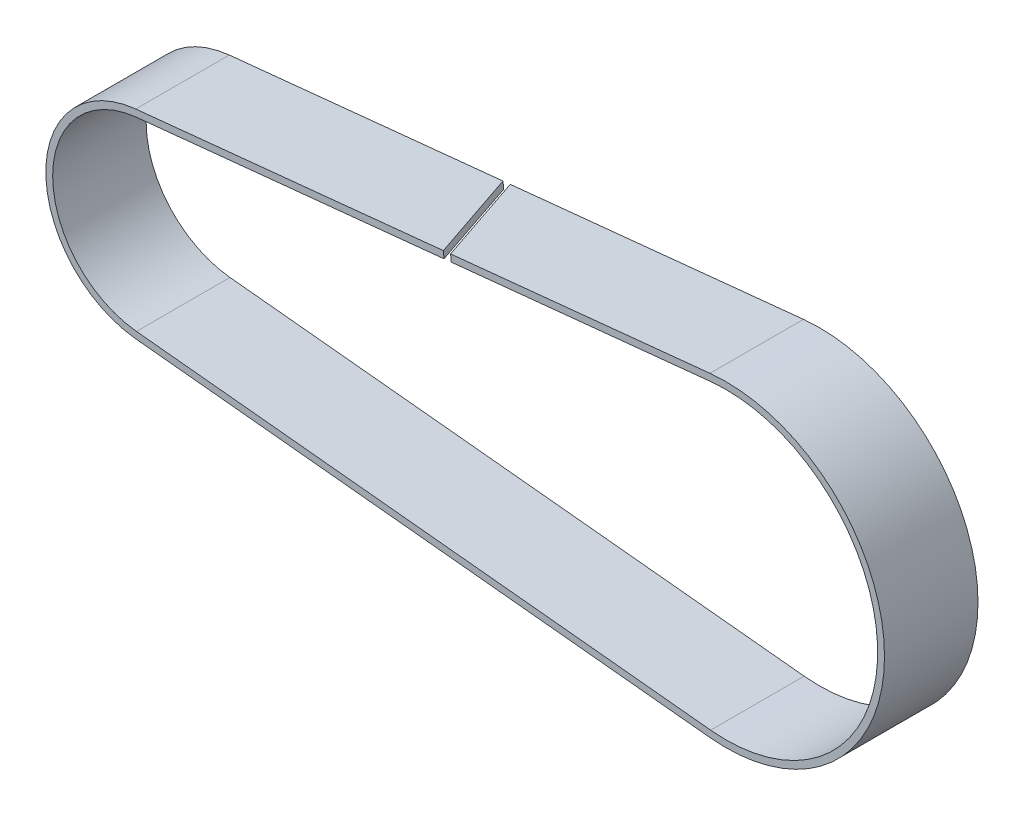
ISO-10303-21;
HEADER;
FILE_DESCRIPTION(('STEP AP214'),'2;1');
FILE_NAME('part.step','',(''),(''),'','','');
FILE_SCHEMA(('AUTOMOTIVE_DESIGN { 1 0 10303 214 1 1 1 1 }'));
ENDSEC;
DATA;
#1=APPLICATION_CONTEXT('core data for automotive mechanical design processes');
#2=APPLICATION_PROTOCOL_DEFINITION('international standard','automotive_design',2000,#1);
#3=PRODUCT_CONTEXT('',#1,'mechanical');
#4=PRODUCT('Part','Part','',(#3));
#5=PRODUCT_RELATED_PRODUCT_CATEGORY('part','',(#4));
#6=PRODUCT_DEFINITION_FORMATION('','',#4);
#7=PRODUCT_DEFINITION_CONTEXT('part definition',#1,'design');
#8=PRODUCT_DEFINITION('design','',#6,#7);
#9=PRODUCT_DEFINITION_SHAPE('','',#8);
#10=(LENGTH_UNIT() NAMED_UNIT(*) SI_UNIT(.MILLI.,.METRE.));
#11=(NAMED_UNIT(*) PLANE_ANGLE_UNIT() SI_UNIT($,.RADIAN.));
#12=(NAMED_UNIT(*) SI_UNIT($,.STERADIAN.) SOLID_ANGLE_UNIT());
#13=UNCERTAINTY_MEASURE_WITH_UNIT(LENGTH_MEASURE(1.E-05),#10,'distance_accuracy_value','');
#14=(GEOMETRIC_REPRESENTATION_CONTEXT(3) GLOBAL_UNCERTAINTY_ASSIGNED_CONTEXT((#13)) GLOBAL_UNIT_ASSIGNED_CONTEXT((#10,
#11,#12)) REPRESENTATION_CONTEXT('',''));
#15=CARTESIAN_POINT('',(0.,0.,0.));
#16=DIRECTION('',(0.,0.,1.));
#17=DIRECTION('',(1.,0.,0.));
#18=AXIS2_PLACEMENT_3D('',#15,#16,#17);
#19=CARTESIAN_POINT('',(-259.435265009831,43.752162452675,20.55));
#20=DIRECTION('',(0.100855584803891,-0.994901075993923,0.));
#21=DIRECTION('',(0.994901075993923,0.100855584803891,0.));
#22=AXIS2_PLACEMENT_3D('',#19,#20,#21);
#23=PLANE('',#22);
#24=DIRECTION('',(-0.994901075993923,-0.100855584803891,0.));
#25=VECTOR('',#24,1.);
#26=CARTESIAN_POINT('',(-259.435265009831,43.752162452675,-20.55));
#27=LINE('',#26,#25);
#28=CARTESIAN_POINT('',(-7.02908650129573,69.3392015622289,-20.55));
#29=VERTEX_POINT('',#28);
#30=CARTESIAN_POINT('',(-135.939003826332,56.2712841455658,-20.55));
#31=VERTEX_POINT('',#30);
#32=EDGE_CURVE('E141',#29,#31,#27,.T.);
#33=ORIENTED_EDGE('',*,*,#32,.T.);
#34=DIRECTION('',(-0.340276208606307,-0.0344946415698214,-0.939692620785907));
#35=VECTOR('',#34,1.);
#36=CARTESIAN_POINT('',(-136.310555060417,56.2336190772466,-21.576060429977));
#37=LINE('',#36,#35);
#38=CARTESIAN_POINT('',(-121.056102902812,57.7800006526019,20.55));
#39=VERTEX_POINT('',#38);
#40=EDGE_CURVE('E126',#39,#31,#37,.T.);
#41=ORIENTED_EDGE('',*,*,#40,.F.);
#42=DIRECTION('',(-0.994901075993923,-0.100855584803891,0.));
#43=VECTOR('',#42,1.);
#44=CARTESIAN_POINT('',(-7.02908650129573,69.3392015622289,20.55));
#45=LINE('',#44,#43);
#46=CARTESIAN_POINT('',(-7.02908650129573,69.3392015622289,20.55));
#47=VERTEX_POINT('',#46);
#48=EDGE_CURVE('E199',#47,#39,#45,.T.);
#49=ORIENTED_EDGE('',*,*,#48,.F.);
#50=DIRECTION('',(0.,0.,1.));
#51=VECTOR('',#50,1.);
#52=CARTESIAN_POINT('',(-7.02908650129573,69.3392015622289,-20.55));
#53=LINE('',#52,#51);
#54=EDGE_CURVE('E194',#29,#47,#53,.T.);
#55=ORIENTED_EDGE('',*,*,#54,.F.);
#56=EDGE_LOOP('',(#33,#41,#49,#55));
#57=FACE_BOUND('',#56,.T.);
#58=ADVANCED_FACE('F32',(#57),#23,.F.);
#59=CARTESIAN_POINT('',(-259.13269825542,40.7674592246933,20.55));
#60=DIRECTION('',(0.100855584803891,-0.994901075993923,0.));
#61=DIRECTION('',(0.994901075993923,0.100855584803891,0.));
#62=AXIS2_PLACEMENT_3D('',#59,#60,#61);
#63=PLANE('',#62);
#64=DIRECTION('',(0.340276208606307,0.0344946415698213,0.939692620785907));
#65=VECTOR('',#64,1.);
#66=CARTESIAN_POINT('',(-136.94082311414,53.1543520756697,-24.152138226324));
#67=LINE('',#66,#65);
#68=CARTESIAN_POINT('',(-135.63643707192,53.286580917584,-20.55));
#69=VERTEX_POINT('',#68);
#70=CARTESIAN_POINT('',(-120.753536148401,54.7952974246201,20.55));
#71=VERTEX_POINT('',#70);
#72=EDGE_CURVE('E11',#69,#71,#67,.T.);
#73=ORIENTED_EDGE('',*,*,#72,.F.);
#74=DIRECTION('',(-0.994901075993923,-0.100855584803891,0.));
#75=VECTOR('',#74,1.);
#76=CARTESIAN_POINT('',(-259.13269825542,40.7674592246933,-20.55));
#77=LINE('',#76,#75);
#78=CARTESIAN_POINT('',(-6.72651974688405,66.3544983342471,-20.55));
#79=VERTEX_POINT('',#78);
#80=EDGE_CURVE('E183',#79,#69,#77,.T.);
#81=ORIENTED_EDGE('',*,*,#80,.F.);
#82=DIRECTION('',(0.,0.,-1.));
#83=VECTOR('',#82,1.);
#84=CARTESIAN_POINT('',(-6.72651974688405,66.3544983342471,20.55));
#85=LINE('',#84,#83);
#86=CARTESIAN_POINT('',(-6.72651974688404,66.3544983342471,20.55));
#87=VERTEX_POINT('',#86);
#88=EDGE_CURVE('E173',#87,#79,#85,.T.);
#89=ORIENTED_EDGE('',*,*,#88,.F.);
#90=DIRECTION('',(-0.994901075993923,-0.100855584803891,0.));
#91=VECTOR('',#90,1.);
#92=CARTESIAN_POINT('',(-259.13269825542,40.7674592246933,20.55));
#93=LINE('',#92,#91);
#94=EDGE_CURVE('E182',#87,#71,#93,.T.);
#95=ORIENTED_EDGE('',*,*,#94,.T.);
#96=EDGE_LOOP('',(#73,#81,#89,#95));
#97=FACE_BOUND('',#96,.T.);
#98=ADVANCED_FACE('F236',(#97),#63,.T.);
#99=CARTESIAN_POINT('',(-255.,0.,20.55));
#100=DIRECTION('',(0.,0.,1.));
#101=DIRECTION('',(1.,0.,0.));
#102=AXIS2_PLACEMENT_3D('',#99,#100,#101);
#103=PLANE('',#102);
#104=DIRECTION('',(-0.100855584803891,0.994901075993923,0.));
#105=VECTOR('',#104,1.);
#106=CARTESIAN_POINT('',(-120.047547054774,47.8309898926627,20.55));
#107=LINE('',#106,#105);
#108=EDGE_CURVE('E125',#71,#39,#107,.T.);
#109=ORIENTED_EDGE('',*,*,#108,.F.);
#110=ORIENTED_EDGE('',*,*,#94,.F.);
#111=CARTESIAN_POINT('',(0.,0.,20.55));
#112=DIRECTION('',(0.,0.,1.));
#113=DIRECTION('',(1.,0.,0.));
#114=AXIS2_PLACEMENT_3D('',#111,#112,#113);
#115=CIRCLE('',#114,66.6945688725463);
#116=CARTESIAN_POINT('',(-6.72651974688407,-66.3544983342471,20.55));
#117=VERTEX_POINT('',#116);
#118=EDGE_CURVE('E177',#117,#87,#115,.T.);
#119=ORIENTED_EDGE('',*,*,#118,.F.);
#120=DIRECTION('',(0.994901075993923,-0.100855584803891,0.));
#121=VECTOR('',#120,1.);
#122=CARTESIAN_POINT('',(-259.13269825542,-40.7674592246933,20.55));
#123=LINE('',#122,#121);
#124=CARTESIAN_POINT('',(-259.13269825542,-40.7674592246933,20.55));
#125=VERTEX_POINT('',#124);
#126=EDGE_CURVE('E174',#125,#117,#123,.T.);
#127=ORIENTED_EDGE('',*,*,#126,.F.);
#128=CARTESIAN_POINT('',(-255.,0.,20.55));
#129=DIRECTION('',(0.,0.,1.));
#130=DIRECTION('',(1.,0.,0.));
#131=AXIS2_PLACEMENT_3D('',#128,#129,#130);
#132=CIRCLE('',#131,40.9763947475541);
#133=CARTESIAN_POINT('',(-259.13269825542,40.7674592246933,20.55));
#134=VERTEX_POINT('',#133);
#135=EDGE_CURVE('E169',#134,#125,#132,.T.);
#136=ORIENTED_EDGE('',*,*,#135,.F.);
#137=CARTESIAN_POINT('',(-123.929790981056,54.473312609885,20.55));
#138=VERTEX_POINT('',#137);
#139=EDGE_CURVE('E190',#138,#134,#93,.T.);
#140=ORIENTED_EDGE('',*,*,#139,.F.);
#141=DIRECTION('',(0.100855584803891,-0.994901075993923,0.));
#142=VECTOR('',#141,1.);
#143=CARTESIAN_POINT('',(-119.797092725636,13.7058533851917,20.55));
#144=LINE('',#143,#142);
#145=CARTESIAN_POINT('',(-124.232357735468,57.4580158378668,20.55));
#146=VERTEX_POINT('',#145);
#147=EDGE_CURVE('E54',#146,#138,#144,.T.);
#148=ORIENTED_EDGE('',*,*,#147,.F.);
#149=CARTESIAN_POINT('',(-259.435265009831,43.752162452675,20.55));
#150=VERTEX_POINT('',#149);
#151=EDGE_CURVE('E134',#146,#150,#45,.T.);
#152=ORIENTED_EDGE('',*,*,#151,.T.);
#153=CARTESIAN_POINT('',(-255.,0.,20.55));
#154=DIRECTION('',(0.,0.,1.));
#155=DIRECTION('',(1.,0.,0.));
#156=AXIS2_PLACEMENT_3D('',#153,#154,#155);
#157=CIRCLE('',#156,43.9763947475541);
#158=CARTESIAN_POINT('',(-259.435265009831,-43.752162452675,20.55));
#159=VERTEX_POINT('',#158);
#160=EDGE_CURVE('E165',#150,#159,#157,.T.);
#161=ORIENTED_EDGE('',*,*,#160,.T.);
#162=DIRECTION('',(0.994901075993923,-0.100855584803891,0.));
#163=VECTOR('',#162,1.);
#164=CARTESIAN_POINT('',(-259.435265009831,-43.752162452675,20.55));
#165=LINE('',#164,#163);
#166=CARTESIAN_POINT('',(-7.02908650129563,-69.3392015622289,20.55));
#167=VERTEX_POINT('',#166);
#168=EDGE_CURVE('E161',#159,#167,#165,.T.);
#169=ORIENTED_EDGE('',*,*,#168,.T.);
#170=CARTESIAN_POINT('',(0.,0.,20.55));
#171=DIRECTION('',(0.,0.,1.));
#172=DIRECTION('',(1.,0.,0.));
#173=AXIS2_PLACEMENT_3D('',#170,#171,#172);
#174=CIRCLE('',#173,69.6945688725463);
#175=EDGE_CURVE('E159',#167,#47,#174,.T.);
#176=ORIENTED_EDGE('',*,*,#175,.T.);
#177=ORIENTED_EDGE('',*,*,#48,.T.);
#178=EDGE_LOOP('',(#109,#110,#119,#127,#136,#140,#148,#152,#161,#169,#176,#177));
#179=FACE_BOUND('',#178,.T.);
#180=ADVANCED_FACE('F34',(#179),#103,.T.);
#181=CARTESIAN_POINT('',(-255.,0.,-20.55));
#182=DIRECTION('',(0.,0.,1.));
#183=DIRECTION('',(1.,0.,0.));
#184=AXIS2_PLACEMENT_3D('',#181,#182,#183);
#185=PLANE('',#184);
#186=ORIENTED_EDGE('',*,*,#80,.T.);
#187=DIRECTION('',(-0.100855584803891,0.994901075993923,0.));
#188=VECTOR('',#187,1.);
#189=CARTESIAN_POINT('',(-131.503738816501,12.5191216928908,-20.55));
#190=LINE('',#189,#188);
#191=EDGE_CURVE('E46',#69,#31,#190,.T.);
#192=ORIENTED_EDGE('',*,*,#191,.T.);
#193=ORIENTED_EDGE('',*,*,#32,.F.);
#194=CARTESIAN_POINT('',(0.,0.,-20.55));
#195=DIRECTION('',(0.,0.,1.));
#196=DIRECTION('',(1.,0.,0.));
#197=AXIS2_PLACEMENT_3D('',#194,#195,#196);
#198=CIRCLE('',#197,69.6945688725463);
#199=CARTESIAN_POINT('',(-7.02908650129563,-69.3392015622289,-20.55));
#200=VERTEX_POINT('',#199);
#201=EDGE_CURVE('E151',#200,#29,#198,.T.);
#202=ORIENTED_EDGE('',*,*,#201,.F.);
#203=DIRECTION('',(0.994901075993923,-0.100855584803891,0.));
#204=VECTOR('',#203,1.);
#205=CARTESIAN_POINT('',(-259.435265009831,-43.752162452675,-20.55));
#206=LINE('',#205,#204);
#207=CARTESIAN_POINT('',(-259.435265009831,-43.752162452675,-20.55));
#208=VERTEX_POINT('',#207);
#209=EDGE_CURVE('E155',#208,#200,#206,.T.);
#210=ORIENTED_EDGE('',*,*,#209,.F.);
#211=CARTESIAN_POINT('',(-255.,0.,-20.55));
#212=DIRECTION('',(0.,0.,1.));
#213=DIRECTION('',(1.,0.,0.));
#214=AXIS2_PLACEMENT_3D('',#211,#212,#213);
#215=CIRCLE('',#214,43.9763947475541);
#216=CARTESIAN_POINT('',(-259.435265009831,43.752162452675,-20.55));
#217=VERTEX_POINT('',#216);
#218=EDGE_CURVE('E139',#217,#208,#215,.T.);
#219=ORIENTED_EDGE('',*,*,#218,.F.);
#220=CARTESIAN_POINT('',(-139.115258658987,55.9492993308308,-20.55));
#221=VERTEX_POINT('',#220);
#222=EDGE_CURVE('E132',#221,#217,#27,.T.);
#223=ORIENTED_EDGE('',*,*,#222,.F.);
#224=DIRECTION('',(-0.100855584803891,0.994901075993923,0.));
#225=VECTOR('',#224,1.);
#226=CARTESIAN_POINT('',(-138.106702810948,46.0002885708915,-20.55));
#227=LINE('',#226,#225);
#228=CARTESIAN_POINT('',(-138.812691904576,52.9645961028489,-20.55));
#229=VERTEX_POINT('',#228);
#230=EDGE_CURVE('E118',#229,#221,#227,.T.);
#231=ORIENTED_EDGE('',*,*,#230,.F.);
#232=CARTESIAN_POINT('',(-259.13269825542,40.7674592246933,-20.55));
#233=VERTEX_POINT('',#232);
#234=EDGE_CURVE('E164',#229,#233,#77,.T.);
#235=ORIENTED_EDGE('',*,*,#234,.T.);
#236=CARTESIAN_POINT('',(-255.,0.,-20.55));
#237=DIRECTION('',(0.,0.,1.));
#238=DIRECTION('',(1.,0.,0.));
#239=AXIS2_PLACEMENT_3D('',#236,#237,#238);
#240=CIRCLE('',#239,40.9763947475541);
#241=CARTESIAN_POINT('',(-259.13269825542,-40.7674592246933,-20.55));
#242=VERTEX_POINT('',#241);
#243=EDGE_CURVE('E184',#233,#242,#240,.T.);
#244=ORIENTED_EDGE('',*,*,#243,.T.);
#245=DIRECTION('',(0.994901075993923,-0.100855584803891,0.));
#246=VECTOR('',#245,1.);
#247=CARTESIAN_POINT('',(-259.13269825542,-40.7674592246933,-20.55));
#248=LINE('',#247,#246);
#249=CARTESIAN_POINT('',(-6.72651974688407,-66.3544983342471,-20.55));
#250=VERTEX_POINT('',#249);
#251=EDGE_CURVE('E145',#242,#250,#248,.T.);
#252=ORIENTED_EDGE('',*,*,#251,.T.);
#253=CARTESIAN_POINT('',(0.,0.,-20.55));
#254=DIRECTION('',(0.,0.,1.));
#255=DIRECTION('',(1.,0.,0.));
#256=AXIS2_PLACEMENT_3D('',#253,#254,#255);
#257=CIRCLE('',#256,66.6945688725463);
#258=EDGE_CURVE('E142',#250,#79,#257,.T.);
#259=ORIENTED_EDGE('',*,*,#258,.T.);
#260=EDGE_LOOP('',(#186,#192,#193,#202,#210,#219,#223,#231,#235,#244,#252,#259));
#261=FACE_BOUND('',#260,.T.);
#262=ADVANCED_FACE('F137',(#261),#185,.F.);
#263=ORIENTED_EDGE('',*,*,#151,.F.);
#264=DIRECTION('',(0.340276208606307,0.0344946415698212,0.939692620785907));
#265=VECTOR('',#264,1.);
#266=CARTESIAN_POINT('',(-139.115258658987,55.9492993308308,-20.55));
#267=LINE('',#266,#265);
#268=EDGE_CURVE('E121',#221,#146,#267,.T.);
#269=ORIENTED_EDGE('',*,*,#268,.F.);
#270=ORIENTED_EDGE('',*,*,#222,.T.);
#271=DIRECTION('',(0.,0.,1.));
#272=VECTOR('',#271,1.);
#273=CARTESIAN_POINT('',(-259.435265009831,43.752162452675,-20.55));
#274=LINE('',#273,#272);
#275=EDGE_CURVE('E181',#217,#150,#274,.T.);
#276=ORIENTED_EDGE('',*,*,#275,.T.);
#277=EDGE_LOOP('',(#263,#269,#270,#276));
#278=FACE_BOUND('',#277,.T.);
#279=ADVANCED_FACE('F130',(#278),#23,.F.);
#280=CARTESIAN_POINT('',(-255.,0.,20.55));
#281=DIRECTION('',(0.,0.,-1.));
#282=DIRECTION('',(-1.,0.,0.));
#283=AXIS2_PLACEMENT_3D('',#280,#281,#282);
#284=CYLINDRICAL_SURFACE('',#283,43.9763947475541);
#285=DIRECTION('',(0.,0.,-1.));
#286=VECTOR('',#285,1.);
#287=CARTESIAN_POINT('',(-259.435265009831,-43.752162452675,20.55));
#288=LINE('',#287,#286);
#289=EDGE_CURVE('E154',#159,#208,#288,.T.);
#290=ORIENTED_EDGE('',*,*,#289,.F.);
#291=ORIENTED_EDGE('',*,*,#160,.F.);
#292=ORIENTED_EDGE('',*,*,#275,.F.);
#293=ORIENTED_EDGE('',*,*,#218,.T.);
#294=EDGE_LOOP('',(#290,#291,#292,#293));
#295=FACE_BOUND('',#294,.T.);
#296=ADVANCED_FACE('F209',(#295),#284,.T.);
#297=CARTESIAN_POINT('',(-259.435265009831,-43.752162452675,20.55));
#298=DIRECTION('',(0.100855584803891,0.994901075993923,0.));
#299=DIRECTION('',(-0.994901075993923,0.100855584803891,0.));
#300=AXIS2_PLACEMENT_3D('',#297,#298,#299);
#301=PLANE('',#300);
#302=DIRECTION('',(0.,0.,-1.));
#303=VECTOR('',#302,1.);
#304=CARTESIAN_POINT('',(-7.02908650129563,-69.3392015622289,20.55));
#305=LINE('',#304,#303);
#306=EDGE_CURVE('E149',#167,#200,#305,.T.);
#307=ORIENTED_EDGE('',*,*,#306,.F.);
#308=ORIENTED_EDGE('',*,*,#168,.F.);
#309=ORIENTED_EDGE('',*,*,#289,.T.);
#310=ORIENTED_EDGE('',*,*,#209,.T.);
#311=EDGE_LOOP('',(#307,#308,#309,#310));
#312=FACE_BOUND('',#311,.T.);
#313=ADVANCED_FACE('F225',(#312),#301,.F.);
#314=CARTESIAN_POINT('',(0.,0.,20.55));
#315=DIRECTION('',(0.,0.,-1.));
#316=DIRECTION('',(-1.,0.,0.));
#317=AXIS2_PLACEMENT_3D('',#314,#315,#316);
#318=CYLINDRICAL_SURFACE('',#317,69.6945688725463);
#319=ORIENTED_EDGE('',*,*,#175,.F.);
#320=ORIENTED_EDGE('',*,*,#306,.T.);
#321=ORIENTED_EDGE('',*,*,#201,.T.);
#322=ORIENTED_EDGE('',*,*,#54,.T.);
#323=EDGE_LOOP('',(#319,#320,#321,#322));
#324=FACE_BOUND('',#323,.T.);
#325=ADVANCED_FACE('F222',(#324),#318,.T.);
#326=CARTESIAN_POINT('',(-255.,0.,20.55));
#327=DIRECTION('',(0.,0.,-1.));
#328=DIRECTION('',(-1.,0.,0.));
#329=AXIS2_PLACEMENT_3D('',#326,#327,#328);
#330=CYLINDRICAL_SURFACE('',#329,40.9763947475541);
#331=DIRECTION('',(0.,0.,-1.));
#332=VECTOR('',#331,1.);
#333=CARTESIAN_POINT('',(-259.13269825542,-40.7674592246933,20.55));
#334=LINE('',#333,#332);
#335=EDGE_CURVE('E166',#125,#242,#334,.T.);
#336=ORIENTED_EDGE('',*,*,#335,.T.);
#337=ORIENTED_EDGE('',*,*,#243,.F.);
#338=DIRECTION('',(0.,0.,-1.));
#339=VECTOR('',#338,1.);
#340=CARTESIAN_POINT('',(-259.13269825542,40.7674592246933,20.55));
#341=LINE('',#340,#339);
#342=EDGE_CURVE('E178',#134,#233,#341,.T.);
#343=ORIENTED_EDGE('',*,*,#342,.F.);
#344=ORIENTED_EDGE('',*,*,#135,.T.);
#345=EDGE_LOOP('',(#336,#337,#343,#344));
#346=FACE_BOUND('',#345,.T.);
#347=ADVANCED_FACE('F232',(#346),#330,.F.);
#348=CARTESIAN_POINT('',(-259.13269825542,-40.7674592246933,20.55));
#349=DIRECTION('',(0.100855584803891,0.994901075993923,0.));
#350=DIRECTION('',(-0.994901075993923,0.100855584803891,0.));
#351=AXIS2_PLACEMENT_3D('',#348,#349,#350);
#352=PLANE('',#351);
#353=ORIENTED_EDGE('',*,*,#126,.T.);
#354=DIRECTION('',(0.,0.,-1.));
#355=VECTOR('',#354,1.);
#356=CARTESIAN_POINT('',(-6.72651974688407,-66.3544983342471,20.55));
#357=LINE('',#356,#355);
#358=EDGE_CURVE('E170',#117,#250,#357,.T.);
#359=ORIENTED_EDGE('',*,*,#358,.T.);
#360=ORIENTED_EDGE('',*,*,#251,.F.);
#361=ORIENTED_EDGE('',*,*,#335,.F.);
#362=EDGE_LOOP('',(#353,#359,#360,#361));
#363=FACE_BOUND('',#362,.T.);
#364=ADVANCED_FACE('F258',(#363),#352,.T.);
#365=CARTESIAN_POINT('',(0.,0.,20.55));
#366=DIRECTION('',(0.,0.,-1.));
#367=DIRECTION('',(-1.,0.,0.));
#368=AXIS2_PLACEMENT_3D('',#365,#366,#367);
#369=CYLINDRICAL_SURFACE('',#368,66.6945688725463);
#370=ORIENTED_EDGE('',*,*,#88,.T.);
#371=ORIENTED_EDGE('',*,*,#258,.F.);
#372=ORIENTED_EDGE('',*,*,#358,.F.);
#373=ORIENTED_EDGE('',*,*,#118,.T.);
#374=EDGE_LOOP('',(#370,#371,#372,#373));
#375=FACE_BOUND('',#374,.T.);
#376=ADVANCED_FACE('F254',(#375),#369,.F.);
#377=DIRECTION('',(-0.340276208606307,-0.0344946415698213,-0.939692620785907));
#378=VECTOR('',#377,1.);
#379=CARTESIAN_POINT('',(-139.74552671271,52.8700323292539,-23.126077796347));
#380=LINE('',#379,#378);
#381=EDGE_CURVE('E40',#138,#229,#380,.T.);
#382=ORIENTED_EDGE('',*,*,#381,.F.);
#383=ORIENTED_EDGE('',*,*,#139,.T.);
#384=ORIENTED_EDGE('',*,*,#342,.T.);
#385=ORIENTED_EDGE('',*,*,#234,.F.);
#386=EDGE_LOOP('',(#382,#383,#384,#385));
#387=FACE_BOUND('',#386,.T.);
#388=ADVANCED_FACE('F243',(#387),#63,.T.);
#389=CARTESIAN_POINT('',(-138.106702810948,46.0002885708915,-20.55));
#390=DIRECTION('',(-0.934901199523448,-0.0947732488052638,0.342020143325672));
#391=DIRECTION('',(0.34356657577343,0.,0.939128323506069));
#392=AXIS2_PLACEMENT_3D('',#389,#390,#391);
#393=PLANE('',#392);
#394=ORIENTED_EDGE('',*,*,#147,.T.);
#395=ORIENTED_EDGE('',*,*,#381,.T.);
#396=ORIENTED_EDGE('',*,*,#230,.T.);
#397=ORIENTED_EDGE('',*,*,#268,.T.);
#398=EDGE_LOOP('',(#394,#395,#396,#397));
#399=FACE_BOUND('',#398,.T.);
#400=ADVANCED_FACE('F120',(#399),#393,.F.);
#401=CARTESIAN_POINT('',(-135.301999212378,46.2846083173073,-21.576060429977));
#402=DIRECTION('',(0.934901199523448,0.0947732488052637,-0.342020143325672));
#403=DIRECTION('',(-0.343566575773431,0.,-0.939128323506069));
#404=AXIS2_PLACEMENT_3D('',#401,#402,#403);
#405=PLANE('',#404);
#406=ORIENTED_EDGE('',*,*,#72,.T.);
#407=ORIENTED_EDGE('',*,*,#108,.T.);
#408=ORIENTED_EDGE('',*,*,#40,.T.);
#409=ORIENTED_EDGE('',*,*,#191,.F.);
#410=EDGE_LOOP('',(#406,#407,#408,#409));
#411=FACE_BOUND('',#410,.T.);
#412=ADVANCED_FACE('F217',(#411),#405,.F.);
#413=CLOSED_SHELL('',(#58,#98,#180,#262,#279,#296,#313,#325,#347,#364,#376,#388,#400,#412));
#414=MANIFOLD_SOLID_BREP('B2',#413);
#415=ADVANCED_BREP_SHAPE_REPRESENTATION('',(#18,#414),#14);
#416=SHAPE_DEFINITION_REPRESENTATION(#9,#415);
ENDSEC;
END-ISO-10303-21;
